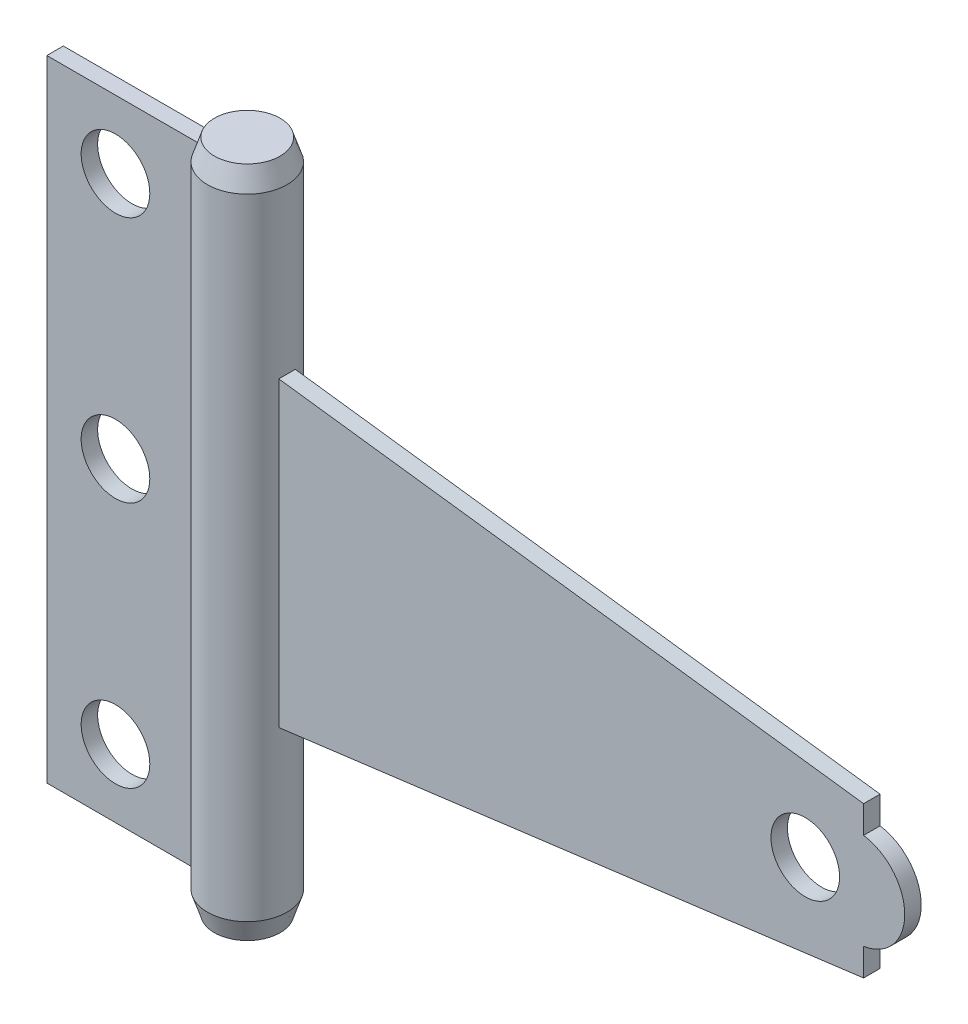
ISO-10303-21;
HEADER;
FILE_DESCRIPTION(('STEP AP214'),'2;1');
FILE_NAME('part.step','',(''),(''),'','','');
FILE_SCHEMA(('AUTOMOTIVE_DESIGN { 1 0 10303 214 1 1 1 1 }'));
ENDSEC;
DATA;
#1=APPLICATION_CONTEXT('core data for automotive mechanical design processes');
#2=APPLICATION_PROTOCOL_DEFINITION('international standard','automotive_design',2000,#1);
#3=PRODUCT_CONTEXT('',#1,'mechanical');
#4=PRODUCT('Part','Part','',(#3));
#5=PRODUCT_RELATED_PRODUCT_CATEGORY('part','',(#4));
#6=PRODUCT_DEFINITION_FORMATION('','',#4);
#7=PRODUCT_DEFINITION_CONTEXT('part definition',#1,'design');
#8=PRODUCT_DEFINITION('design','',#6,#7);
#9=PRODUCT_DEFINITION_SHAPE('','',#8);
#10=(LENGTH_UNIT() NAMED_UNIT(*) SI_UNIT(.MILLI.,.METRE.));
#11=(NAMED_UNIT(*) PLANE_ANGLE_UNIT() SI_UNIT($,.RADIAN.));
#12=(NAMED_UNIT(*) SI_UNIT($,.STERADIAN.) SOLID_ANGLE_UNIT());
#13=UNCERTAINTY_MEASURE_WITH_UNIT(LENGTH_MEASURE(1.E-05),#10,'distance_accuracy_value','');
#14=(GEOMETRIC_REPRESENTATION_CONTEXT(3) GLOBAL_UNCERTAINTY_ASSIGNED_CONTEXT((#13)) GLOBAL_UNIT_ASSIGNED_CONTEXT((#10,
#11,#12)) REPRESENTATION_CONTEXT('',''));
#15=CARTESIAN_POINT('',(0.,0.,0.));
#16=DIRECTION('',(0.,0.,1.));
#17=DIRECTION('',(1.,0.,0.));
#18=AXIS2_PLACEMENT_3D('',#15,#16,#17);
#19=CARTESIAN_POINT('',(0.,24.5,0.));
#20=DIRECTION('',(0.,1.,0.));
#21=DIRECTION('',(0.,0.,1.));
#22=AXIS2_PLACEMENT_3D('',#19,#20,#21);
#23=PLANE('',#22);
#24=CARTESIAN_POINT('',(0.,24.5,0.));
#25=DIRECTION('',(0.,-1.,0.));
#26=DIRECTION('',(0.,0.,-1.));
#27=AXIS2_PLACEMENT_3D('',#24,#25,#26);
#28=CIRCLE('',#27,2.39399158911085);
#29=CARTESIAN_POINT('',(0.,24.5,-2.39399158911085));
#30=VERTEX_POINT('',#29);
#31=EDGE_CURVE('E64',#30,#30,#28,.T.);
#32=ORIENTED_EDGE('',*,*,#31,.F.);
#33=EDGE_LOOP('',(#32));
#34=FACE_BOUND('',#33,.T.);
#35=ADVANCED_FACE('F50',(#34),#23,.T.);
#36=CARTESIAN_POINT('',(0.,-24.5,0.));
#37=DIRECTION('',(0.,1.,0.));
#38=DIRECTION('',(0.,0.,1.));
#39=AXIS2_PLACEMENT_3D('',#36,#37,#38);
#40=PLANE('',#39);
#41=CARTESIAN_POINT('',(0.,-24.5,0.));
#42=DIRECTION('',(0.,-1.,0.));
#43=DIRECTION('',(0.,0.,-1.));
#44=AXIS2_PLACEMENT_3D('',#41,#42,#43);
#45=CIRCLE('',#44,2.39399158911085);
#46=CARTESIAN_POINT('',(0.,-24.5,-2.39399158911085));
#47=VERTEX_POINT('',#46);
#48=EDGE_CURVE('E11',#47,#47,#45,.T.);
#49=ORIENTED_EDGE('',*,*,#48,.T.);
#50=EDGE_LOOP('',(#49));
#51=FACE_BOUND('',#50,.T.);
#52=ADVANCED_FACE('F73',(#51),#40,.F.);
#53=CARTESIAN_POINT('',(0.,-24.5,0.));
#54=DIRECTION('',(0.,1.,0.));
#55=DIRECTION('',(0.,0.,1.));
#56=AXIS2_PLACEMENT_3D('',#53,#54,#55);
#57=CONICAL_SURFACE('',#56,2.39399158911085,0.315549176334795);
#58=CARTESIAN_POINT('',(0.,-22.95,0.));
#59=DIRECTION('',(0.,-1.,0.));
#60=DIRECTION('',(0.,0.,-1.));
#61=AXIS2_PLACEMENT_3D('',#58,#59,#60);
#62=CIRCLE('',#61,2.9);
#63=CARTESIAN_POINT('',(0.,-22.95,-2.9));
#64=VERTEX_POINT('',#63);
#65=EDGE_CURVE('E56',#64,#64,#62,.T.);
#66=ORIENTED_EDGE('',*,*,#65,.T.);
#67=EDGE_LOOP('',(#66));
#68=FACE_BOUND('',#67,.T.);
#69=ORIENTED_EDGE('',*,*,#48,.F.);
#70=EDGE_LOOP('',(#69));
#71=FACE_BOUND('',#70,.T.);
#72=ADVANCED_FACE('F77',(#68,#71),#57,.T.);
#73=CARTESIAN_POINT('',(0.,0.,0.));
#74=DIRECTION('',(0.,-1.,0.));
#75=DIRECTION('',(0.,0.,-1.));
#76=AXIS2_PLACEMENT_3D('',#73,#74,#75);
#77=CYLINDRICAL_SURFACE('',#76,2.9);
#78=CARTESIAN_POINT('',(0.,22.95,0.));
#79=DIRECTION('',(0.,-1.,0.));
#80=DIRECTION('',(0.,0.,-1.));
#81=AXIS2_PLACEMENT_3D('',#78,#79,#80);
#82=CIRCLE('',#81,2.9);
#83=CARTESIAN_POINT('',(0.,22.95,-2.9));
#84=VERTEX_POINT('',#83);
#85=EDGE_CURVE('E60',#84,#84,#82,.T.);
#86=ORIENTED_EDGE('',*,*,#85,.T.);
#87=EDGE_LOOP('',(#86));
#88=FACE_BOUND('',#87,.T.);
#89=ORIENTED_EDGE('',*,*,#65,.F.);
#90=EDGE_LOOP('',(#89));
#91=FACE_BOUND('',#90,.T.);
#92=ADVANCED_FACE('F81',(#88,#91),#77,.T.);
#93=CARTESIAN_POINT('',(0.,24.5,0.));
#94=DIRECTION('',(0.,-1.,0.));
#95=DIRECTION('',(0.,0.,-1.));
#96=AXIS2_PLACEMENT_3D('',#93,#94,#95);
#97=CONICAL_SURFACE('',#96,2.39399158911085,0.315549176334797);
#98=ORIENTED_EDGE('',*,*,#85,.F.);
#99=EDGE_LOOP('',(#98));
#100=FACE_BOUND('',#99,.T.);
#101=ORIENTED_EDGE('',*,*,#31,.T.);
#102=EDGE_LOOP('',(#101));
#103=FACE_BOUND('',#102,.T.);
#104=ADVANCED_FACE('F70',(#100,#103),#97,.T.);
#105=CLOSED_SHELL('',(#35,#52,#72,#92,#104));
#106=MANIFOLD_SOLID_BREP('B2',#105);
#107=CARTESIAN_POINT('',(44.9583333333333,0.,0.6));
#108=DIRECTION('',(0.,0.,-1.));
#109=DIRECTION('',(-1.,0.,0.));
#110=AXIS2_PLACEMENT_3D('',#107,#108,#109);
#111=CYLINDRICAL_SURFACE('',#110,3.54166666666667);
#112=CARTESIAN_POINT('',(44.9583333333333,0.,-0.6));
#113=DIRECTION('',(0.,0.,1.));
#114=DIRECTION('',(1.,0.,0.));
#115=AXIS2_PLACEMENT_3D('',#112,#113,#114);
#116=CIRCLE('',#115,3.54166666666667);
#117=CARTESIAN_POINT('',(45.5,3.5,-0.6));
#118=VERTEX_POINT('',#117);
#119=CARTESIAN_POINT('',(45.5,-3.5,-0.6));
#120=VERTEX_POINT('',#119);
#121=EDGE_CURVE('E231',#118,#120,#116,.F.);
#122=ORIENTED_EDGE('',*,*,#121,.F.);
#123=DIRECTION('',(0.,0.,-1.));
#124=VECTOR('',#123,1.);
#125=CARTESIAN_POINT('',(45.5,3.5,0.6));
#126=LINE('',#125,#124);
#127=CARTESIAN_POINT('',(45.5,3.5,0.6));
#128=VERTEX_POINT('',#127);
#129=EDGE_CURVE('E48',#128,#118,#126,.T.);
#130=ORIENTED_EDGE('',*,*,#129,.F.);
#131=CARTESIAN_POINT('',(44.9583333333333,0.,0.6));
#132=DIRECTION('',(0.,0.,1.));
#133=DIRECTION('',(1.,0.,0.));
#134=AXIS2_PLACEMENT_3D('',#131,#132,#133);
#135=CIRCLE('',#134,3.54166666666667);
#136=CARTESIAN_POINT('',(45.5,-3.5,0.6));
#137=VERTEX_POINT('',#136);
#138=EDGE_CURVE('E271',#128,#137,#135,.F.);
#139=ORIENTED_EDGE('',*,*,#138,.T.);
#140=DIRECTION('',(0.,0.,-1.));
#141=VECTOR('',#140,1.);
#142=CARTESIAN_POINT('',(45.5,-3.5,0.6));
#143=LINE('',#142,#141);
#144=EDGE_CURVE('E181',#137,#120,#143,.T.);
#145=ORIENTED_EDGE('',*,*,#144,.T.);
#146=EDGE_LOOP('',(#122,#130,#139,#145));
#147=FACE_BOUND('',#146,.T.);
#148=ADVANCED_FACE('F136',(#147),#111,.T.);
#149=CARTESIAN_POINT('',(45.5,0.,0.6));
#150=DIRECTION('',(1.,0.,0.));
#151=DIRECTION('',(0.,0.,-1.));
#152=AXIS2_PLACEMENT_3D('',#149,#150,#151);
#153=PLANE('',#152);
#154=DIRECTION('',(0.,-1.,0.));
#155=VECTOR('',#154,1.);
#156=CARTESIAN_POINT('',(45.5,0.,-0.6));
#157=LINE('',#156,#155);
#158=CARTESIAN_POINT('',(45.5,5.5,-0.6));
#159=VERTEX_POINT('',#158);
#160=EDGE_CURVE('E229',#159,#118,#157,.T.);
#161=ORIENTED_EDGE('',*,*,#160,.F.);
#162=DIRECTION('',(0.,0.,-1.));
#163=VECTOR('',#162,1.);
#164=CARTESIAN_POINT('',(45.5,5.5,0.6));
#165=LINE('',#164,#163);
#166=CARTESIAN_POINT('',(45.5,5.5,0.6));
#167=VERTEX_POINT('',#166);
#168=EDGE_CURVE('E145',#167,#159,#165,.T.);
#169=ORIENTED_EDGE('',*,*,#168,.F.);
#170=DIRECTION('',(0.,-1.,0.));
#171=VECTOR('',#170,1.);
#172=CARTESIAN_POINT('',(45.5,0.,0.6));
#173=LINE('',#172,#171);
#174=EDGE_CURVE('E273',#167,#128,#173,.T.);
#175=ORIENTED_EDGE('',*,*,#174,.T.);
#176=ORIENTED_EDGE('',*,*,#129,.T.);
#177=EDGE_LOOP('',(#161,#169,#175,#176));
#178=FACE_BOUND('',#177,.T.);
#179=ADVANCED_FACE('F230',(#178),#153,.T.);
#180=CARTESIAN_POINT('',(1.44445016558176,11.1879231006878,0.6));
#181=DIRECTION('',(0.128045207218911,0.991768332277385,0.));
#182=DIRECTION('',(-0.991768332277385,0.128045207218911,0.));
#183=AXIS2_PLACEMENT_3D('',#180,#181,#182);
#184=PLANE('',#183);
#185=DIRECTION('',(0.991768332277385,-0.128045207218911,0.));
#186=VECTOR('',#185,1.);
#187=CARTESIAN_POINT('',(1.44445016558176,11.1879231006878,-0.6));
#188=LINE('',#187,#186);
#189=CARTESIAN_POINT('',(2.9,11.,-0.6));
#190=VERTEX_POINT('',#189);
#191=EDGE_CURVE('E225',#190,#159,#188,.T.);
#192=ORIENTED_EDGE('',*,*,#191,.F.);
#193=DIRECTION('',(0.,0.,-1.));
#194=VECTOR('',#193,1.);
#195=CARTESIAN_POINT('',(2.9,11.,0.6));
#196=LINE('',#195,#194);
#197=CARTESIAN_POINT('',(2.9,11.,0.6));
#198=VERTEX_POINT('',#197);
#199=EDGE_CURVE('E215',#198,#190,#196,.T.);
#200=ORIENTED_EDGE('',*,*,#199,.F.);
#201=DIRECTION('',(0.991768332277385,-0.128045207218911,0.));
#202=VECTOR('',#201,1.);
#203=CARTESIAN_POINT('',(1.44445016558176,11.1879231006878,0.6));
#204=LINE('',#203,#202);
#205=EDGE_CURVE('E209',#198,#167,#204,.T.);
#206=ORIENTED_EDGE('',*,*,#205,.T.);
#207=ORIENTED_EDGE('',*,*,#168,.T.);
#208=EDGE_LOOP('',(#192,#200,#206,#207));
#209=FACE_BOUND('',#208,.T.);
#210=ADVANCED_FACE('F223',(#209),#184,.T.);
#211=CARTESIAN_POINT('',(2.9,0.,0.6));
#212=DIRECTION('',(1.,0.,0.));
#213=DIRECTION('',(0.,0.,-1.));
#214=AXIS2_PLACEMENT_3D('',#211,#212,#213);
#215=PLANE('',#214);
#216=DIRECTION('',(0.,-1.,0.));
#217=VECTOR('',#216,1.);
#218=CARTESIAN_POINT('',(2.9,0.,-0.6));
#219=LINE('',#218,#217);
#220=CARTESIAN_POINT('',(2.9,-11.,-0.6));
#221=VERTEX_POINT('',#220);
#222=EDGE_CURVE('E214',#190,#221,#219,.T.);
#223=ORIENTED_EDGE('',*,*,#222,.T.);
#224=DIRECTION('',(0.,0.,-1.));
#225=VECTOR('',#224,1.);
#226=CARTESIAN_POINT('',(2.9,-11.,0.6));
#227=LINE('',#226,#225);
#228=CARTESIAN_POINT('',(2.9,-11.,0.6));
#229=VERTEX_POINT('',#228);
#230=EDGE_CURVE('E199',#229,#221,#227,.T.);
#231=ORIENTED_EDGE('',*,*,#230,.F.);
#232=DIRECTION('',(0.,-1.,0.));
#233=VECTOR('',#232,1.);
#234=CARTESIAN_POINT('',(2.9,0.,0.6));
#235=LINE('',#234,#233);
#236=EDGE_CURVE('E202',#198,#229,#235,.T.);
#237=ORIENTED_EDGE('',*,*,#236,.F.);
#238=ORIENTED_EDGE('',*,*,#199,.T.);
#239=EDGE_LOOP('',(#223,#231,#237,#238));
#240=FACE_BOUND('',#239,.T.);
#241=ADVANCED_FACE('F212',(#240),#215,.F.);
#242=CARTESIAN_POINT('',(1.44445016558176,-11.1879231006878,0.6));
#243=DIRECTION('',(-0.128045207218911,0.991768332277385,0.));
#244=DIRECTION('',(-0.991768332277385,-0.128045207218911,0.));
#245=AXIS2_PLACEMENT_3D('',#242,#243,#244);
#246=PLANE('',#245);
#247=DIRECTION('',(0.991768332277385,0.128045207218911,0.));
#248=VECTOR('',#247,1.);
#249=CARTESIAN_POINT('',(1.44445016558176,-11.1879231006878,-0.6));
#250=LINE('',#249,#248);
#251=CARTESIAN_POINT('',(45.5,-5.5,-0.6));
#252=VERTEX_POINT('',#251);
#253=EDGE_CURVE('E235',#221,#252,#250,.T.);
#254=ORIENTED_EDGE('',*,*,#253,.T.);
#255=DIRECTION('',(0.,0.,-1.));
#256=VECTOR('',#255,1.);
#257=CARTESIAN_POINT('',(45.5,-5.5,0.6));
#258=LINE('',#257,#256);
#259=CARTESIAN_POINT('',(45.5,-5.5,0.6));
#260=VERTEX_POINT('',#259);
#261=EDGE_CURVE('E201',#260,#252,#258,.T.);
#262=ORIENTED_EDGE('',*,*,#261,.F.);
#263=DIRECTION('',(0.991768332277385,0.128045207218911,0.));
#264=VECTOR('',#263,1.);
#265=CARTESIAN_POINT('',(1.44445016558176,-11.1879231006878,0.6));
#266=LINE('',#265,#264);
#267=EDGE_CURVE('E194',#229,#260,#266,.T.);
#268=ORIENTED_EDGE('',*,*,#267,.F.);
#269=ORIENTED_EDGE('',*,*,#230,.T.);
#270=EDGE_LOOP('',(#254,#262,#268,#269));
#271=FACE_BOUND('',#270,.T.);
#272=ADVANCED_FACE('F197',(#271),#246,.F.);
#273=CARTESIAN_POINT('',(41.25,0.,0.6));
#274=DIRECTION('',(0.,0.,-1.));
#275=DIRECTION('',(-1.,0.,0.));
#276=AXIS2_PLACEMENT_3D('',#273,#274,#275);
#277=CYLINDRICAL_SURFACE('',#276,2.5);
#278=CARTESIAN_POINT('',(41.25,0.,0.6));
#279=DIRECTION('',(0.,0.,1.));
#280=DIRECTION('',(1.,0.,0.));
#281=AXIS2_PLACEMENT_3D('',#278,#279,#280);
#282=CIRCLE('',#281,2.5);
#283=CARTESIAN_POINT('',(43.75,0.,0.6));
#284=VERTEX_POINT('',#283);
#285=EDGE_CURVE('E240',#284,#284,#282,.T.);
#286=ORIENTED_EDGE('',*,*,#285,.T.);
#287=EDGE_LOOP('',(#286));
#288=FACE_BOUND('',#287,.T.);
#289=CARTESIAN_POINT('',(41.25,0.,-0.6));
#290=DIRECTION('',(0.,0.,1.));
#291=DIRECTION('',(1.,0.,0.));
#292=AXIS2_PLACEMENT_3D('',#289,#290,#291);
#293=CIRCLE('',#292,2.5);
#294=CARTESIAN_POINT('',(43.75,0.,-0.6));
#295=VERTEX_POINT('',#294);
#296=EDGE_CURVE('E243',#295,#295,#293,.T.);
#297=ORIENTED_EDGE('',*,*,#296,.F.);
#298=EDGE_LOOP('',(#297));
#299=FACE_BOUND('',#298,.T.);
#300=ADVANCED_FACE('F138',(#288,#299),#277,.F.);
#301=CARTESIAN_POINT('',(45.5,0.,0.6));
#302=DIRECTION('',(-1.,0.,0.));
#303=DIRECTION('',(0.,0.,1.));
#304=AXIS2_PLACEMENT_3D('',#301,#302,#303);
#305=PLANE('',#304);
#306=DIRECTION('',(0.,1.,0.));
#307=VECTOR('',#306,1.);
#308=CARTESIAN_POINT('',(45.5,0.,-0.6));
#309=LINE('',#308,#307);
#310=EDGE_CURVE('E174',#252,#120,#309,.T.);
#311=ORIENTED_EDGE('',*,*,#310,.T.);
#312=ORIENTED_EDGE('',*,*,#144,.F.);
#313=DIRECTION('',(0.,1.,0.));
#314=VECTOR('',#313,1.);
#315=CARTESIAN_POINT('',(45.5,0.,0.6));
#316=LINE('',#315,#314);
#317=EDGE_CURVE('E153',#260,#137,#316,.T.);
#318=ORIENTED_EDGE('',*,*,#317,.F.);
#319=ORIENTED_EDGE('',*,*,#261,.T.);
#320=EDGE_LOOP('',(#311,#312,#318,#319));
#321=FACE_BOUND('',#320,.T.);
#322=ADVANCED_FACE('F257',(#321),#305,.F.);
#323=CARTESIAN_POINT('',(0.,0.,0.6));
#324=DIRECTION('',(0.,0.,1.));
#325=DIRECTION('',(1.,0.,0.));
#326=AXIS2_PLACEMENT_3D('',#323,#324,#325);
#327=PLANE('',#326);
#328=ORIENTED_EDGE('',*,*,#285,.F.);
#329=EDGE_LOOP('',(#328));
#330=FACE_BOUND('',#329,.T.);
#331=ORIENTED_EDGE('',*,*,#138,.F.);
#332=ORIENTED_EDGE('',*,*,#174,.F.);
#333=ORIENTED_EDGE('',*,*,#205,.F.);
#334=ORIENTED_EDGE('',*,*,#236,.T.);
#335=ORIENTED_EDGE('',*,*,#267,.T.);
#336=ORIENTED_EDGE('',*,*,#317,.T.);
#337=EDGE_LOOP('',(#331,#332,#333,#334,#335,#336));
#338=FACE_BOUND('',#337,.T.);
#339=ADVANCED_FACE('F206',(#330,#338),#327,.T.);
#340=CARTESIAN_POINT('',(0.,0.,-0.6));
#341=DIRECTION('',(0.,0.,1.));
#342=DIRECTION('',(1.,0.,0.));
#343=AXIS2_PLACEMENT_3D('',#340,#341,#342);
#344=PLANE('',#343);
#345=ORIENTED_EDGE('',*,*,#296,.T.);
#346=EDGE_LOOP('',(#345));
#347=FACE_BOUND('',#346,.T.);
#348=ORIENTED_EDGE('',*,*,#121,.T.);
#349=ORIENTED_EDGE('',*,*,#310,.F.);
#350=ORIENTED_EDGE('',*,*,#253,.F.);
#351=ORIENTED_EDGE('',*,*,#222,.F.);
#352=ORIENTED_EDGE('',*,*,#191,.T.);
#353=ORIENTED_EDGE('',*,*,#160,.T.);
#354=EDGE_LOOP('',(#348,#349,#350,#351,#352,#353));
#355=FACE_BOUND('',#354,.T.);
#356=ADVANCED_FACE('F233',(#347,#355),#344,.F.);
#357=CLOSED_SHELL('',(#148,#179,#210,#241,#272,#300,#322,#339,#356));
#358=MANIFOLD_SOLID_BREP('B6',#357);
#359=CARTESIAN_POINT('',(0.,-22.95,0.6));
#360=DIRECTION('',(0.,-1.,0.));
#361=DIRECTION('',(1.,0.,0.));
#362=AXIS2_PLACEMENT_3D('',#359,#360,#361);
#363=PLANE('',#362);
#364=DIRECTION('',(-1.,0.,0.));
#365=VECTOR('',#364,1.);
#366=CARTESIAN_POINT('',(0.,-22.95,-0.6));
#367=LINE('',#366,#365);
#368=CARTESIAN_POINT('',(-2.9,-22.95,-0.6));
#369=VERTEX_POINT('',#368);
#370=CARTESIAN_POINT('',(-14.,-22.95,-0.6));
#371=VERTEX_POINT('',#370);
#372=EDGE_CURVE('E410',#369,#371,#367,.T.);
#373=ORIENTED_EDGE('',*,*,#372,.F.);
#374=DIRECTION('',(0.,0.,-1.));
#375=VECTOR('',#374,1.);
#376=CARTESIAN_POINT('',(-2.9,-22.95,0.6));
#377=LINE('',#376,#375);
#378=CARTESIAN_POINT('',(-2.9,-22.95,0.6));
#379=VERTEX_POINT('',#378);
#380=EDGE_CURVE('E134',#379,#369,#377,.T.);
#381=ORIENTED_EDGE('',*,*,#380,.F.);
#382=DIRECTION('',(-1.,0.,0.));
#383=VECTOR('',#382,1.);
#384=CARTESIAN_POINT('',(0.,-22.95,0.6));
#385=LINE('',#384,#383);
#386=CARTESIAN_POINT('',(-14.,-22.95,0.6));
#387=VERTEX_POINT('',#386);
#388=EDGE_CURVE('E394',#379,#387,#385,.T.);
#389=ORIENTED_EDGE('',*,*,#388,.T.);
#390=DIRECTION('',(0.,0.,-1.));
#391=VECTOR('',#390,1.);
#392=CARTESIAN_POINT('',(-14.,-22.95,0.6));
#393=LINE('',#392,#391);
#394=EDGE_CURVE('E373',#387,#371,#393,.T.);
#395=ORIENTED_EDGE('',*,*,#394,.T.);
#396=EDGE_LOOP('',(#373,#381,#389,#395));
#397=FACE_BOUND('',#396,.T.);
#398=ADVANCED_FACE('F333',(#397),#363,.T.);
#399=CARTESIAN_POINT('',(-2.9,0.,0.6));
#400=DIRECTION('',(1.,0.,0.));
#401=DIRECTION('',(0.,0.,-1.));
#402=AXIS2_PLACEMENT_3D('',#399,#400,#401);
#403=PLANE('',#402);
#404=DIRECTION('',(0.,-1.,0.));
#405=VECTOR('',#404,1.);
#406=CARTESIAN_POINT('',(-2.9,0.,-0.6));
#407=LINE('',#406,#405);
#408=CARTESIAN_POINT('',(-2.9,22.95,-0.6));
#409=VERTEX_POINT('',#408);
#410=EDGE_CURVE('E385',#409,#369,#407,.T.);
#411=ORIENTED_EDGE('',*,*,#410,.F.);
#412=DIRECTION('',(0.,0.,-1.));
#413=VECTOR('',#412,1.);
#414=CARTESIAN_POINT('',(-2.9,22.95,0.6));
#415=LINE('',#414,#413);
#416=CARTESIAN_POINT('',(-2.9,22.95,0.6));
#417=VERTEX_POINT('',#416);
#418=EDGE_CURVE('E342',#417,#409,#415,.T.);
#419=ORIENTED_EDGE('',*,*,#418,.F.);
#420=DIRECTION('',(0.,-1.,0.));
#421=VECTOR('',#420,1.);
#422=CARTESIAN_POINT('',(-2.9,0.,0.6));
#423=LINE('',#422,#421);
#424=EDGE_CURVE('E383',#417,#379,#423,.T.);
#425=ORIENTED_EDGE('',*,*,#424,.T.);
#426=ORIENTED_EDGE('',*,*,#380,.T.);
#427=EDGE_LOOP('',(#411,#419,#425,#426));
#428=FACE_BOUND('',#427,.T.);
#429=ADVANCED_FACE('F381',(#428),#403,.T.);
#430=CARTESIAN_POINT('',(0.,22.95,0.6));
#431=DIRECTION('',(0.,-1.,0.));
#432=DIRECTION('',(1.,0.,0.));
#433=AXIS2_PLACEMENT_3D('',#430,#431,#432);
#434=PLANE('',#433);
#435=DIRECTION('',(-1.,0.,0.));
#436=VECTOR('',#435,1.);
#437=CARTESIAN_POINT('',(0.,22.95,-0.6));
#438=LINE('',#437,#436);
#439=CARTESIAN_POINT('',(-14.,22.95,-0.6));
#440=VERTEX_POINT('',#439);
#441=EDGE_CURVE('E413',#409,#440,#438,.T.);
#442=ORIENTED_EDGE('',*,*,#441,.T.);
#443=DIRECTION('',(0.,0.,-1.));
#444=VECTOR('',#443,1.);
#445=CARTESIAN_POINT('',(-14.,22.95,0.6));
#446=LINE('',#445,#444);
#447=CARTESIAN_POINT('',(-14.,22.95,0.6));
#448=VERTEX_POINT('',#447);
#449=EDGE_CURVE('E388',#448,#440,#446,.T.);
#450=ORIENTED_EDGE('',*,*,#449,.F.);
#451=DIRECTION('',(-1.,0.,0.));
#452=VECTOR('',#451,1.);
#453=CARTESIAN_POINT('',(0.,22.95,0.6));
#454=LINE('',#453,#452);
#455=EDGE_CURVE('E390',#417,#448,#454,.T.);
#456=ORIENTED_EDGE('',*,*,#455,.F.);
#457=ORIENTED_EDGE('',*,*,#418,.T.);
#458=EDGE_LOOP('',(#442,#450,#456,#457));
#459=FACE_BOUND('',#458,.T.);
#460=ADVANCED_FACE('F391',(#459),#434,.F.);
#461=CARTESIAN_POINT('',(-9.,18.,0.6));
#462=DIRECTION('',(0.,0.,-1.));
#463=DIRECTION('',(-1.,0.,0.));
#464=AXIS2_PLACEMENT_3D('',#461,#462,#463);
#465=CYLINDRICAL_SURFACE('',#464,2.5);
#466=CARTESIAN_POINT('',(-9.,18.,0.6));
#467=DIRECTION('',(0.,0.,1.));
#468=DIRECTION('',(1.,0.,0.));
#469=AXIS2_PLACEMENT_3D('',#466,#467,#468);
#470=CIRCLE('',#469,2.5);
#471=CARTESIAN_POINT('',(-6.5,18.,0.6));
#472=VERTEX_POINT('',#471);
#473=EDGE_CURVE('E396',#472,#472,#470,.T.);
#474=ORIENTED_EDGE('',*,*,#473,.T.);
#475=EDGE_LOOP('',(#474));
#476=FACE_BOUND('',#475,.T.);
#477=CARTESIAN_POINT('',(-9.,18.,-0.6));
#478=DIRECTION('',(0.,0.,1.));
#479=DIRECTION('',(1.,0.,0.));
#480=AXIS2_PLACEMENT_3D('',#477,#478,#479);
#481=CIRCLE('',#480,2.5);
#482=CARTESIAN_POINT('',(-6.5,18.,-0.6));
#483=VERTEX_POINT('',#482);
#484=EDGE_CURVE('E407',#483,#483,#481,.T.);
#485=ORIENTED_EDGE('',*,*,#484,.F.);
#486=EDGE_LOOP('',(#485));
#487=FACE_BOUND('',#486,.T.);
#488=ADVANCED_FACE('F429',(#476,#487),#465,.F.);
#489=CARTESIAN_POINT('',(-9.,0.,0.6));
#490=DIRECTION('',(0.,0.,-1.));
#491=DIRECTION('',(-1.,0.,0.));
#492=AXIS2_PLACEMENT_3D('',#489,#490,#491);
#493=CYLINDRICAL_SURFACE('',#492,2.5);
#494=CARTESIAN_POINT('',(-9.,0.,0.6));
#495=DIRECTION('',(0.,0.,1.));
#496=DIRECTION('',(1.,0.,0.));
#497=AXIS2_PLACEMENT_3D('',#494,#495,#496);
#498=CIRCLE('',#497,2.5);
#499=CARTESIAN_POINT('',(-6.5,0.,0.6));
#500=VERTEX_POINT('',#499);
#501=EDGE_CURVE('E442',#500,#500,#498,.T.);
#502=ORIENTED_EDGE('',*,*,#501,.T.);
#503=EDGE_LOOP('',(#502));
#504=FACE_BOUND('',#503,.T.);
#505=CARTESIAN_POINT('',(-9.,0.,-0.6));
#506=DIRECTION('',(0.,0.,1.));
#507=DIRECTION('',(1.,0.,0.));
#508=AXIS2_PLACEMENT_3D('',#505,#506,#507);
#509=CIRCLE('',#508,2.5);
#510=CARTESIAN_POINT('',(-6.5,0.,-0.6));
#511=VERTEX_POINT('',#510);
#512=EDGE_CURVE('E404',#511,#511,#509,.T.);
#513=ORIENTED_EDGE('',*,*,#512,.F.);
#514=EDGE_LOOP('',(#513));
#515=FACE_BOUND('',#514,.T.);
#516=ADVANCED_FACE('F431',(#504,#515),#493,.F.);
#517=CARTESIAN_POINT('',(-9.,-18.,0.6));
#518=DIRECTION('',(0.,0.,-1.));
#519=DIRECTION('',(-1.,0.,0.));
#520=AXIS2_PLACEMENT_3D('',#517,#518,#519);
#521=CYLINDRICAL_SURFACE('',#520,2.5);
#522=CARTESIAN_POINT('',(-9.,-18.,0.6));
#523=DIRECTION('',(0.,0.,1.));
#524=DIRECTION('',(1.,0.,0.));
#525=AXIS2_PLACEMENT_3D('',#522,#523,#524);
#526=CIRCLE('',#525,2.5);
#527=CARTESIAN_POINT('',(-6.5,-18.,0.6));
#528=VERTEX_POINT('',#527);
#529=EDGE_CURVE('E416',#528,#528,#526,.T.);
#530=ORIENTED_EDGE('',*,*,#529,.T.);
#531=EDGE_LOOP('',(#530));
#532=FACE_BOUND('',#531,.T.);
#533=CARTESIAN_POINT('',(-9.,-18.,-0.6));
#534=DIRECTION('',(0.,0.,1.));
#535=DIRECTION('',(1.,0.,0.));
#536=AXIS2_PLACEMENT_3D('',#533,#534,#535);
#537=CIRCLE('',#536,2.5);
#538=CARTESIAN_POINT('',(-6.5,-18.,-0.6));
#539=VERTEX_POINT('',#538);
#540=EDGE_CURVE('E401',#539,#539,#537,.T.);
#541=ORIENTED_EDGE('',*,*,#540,.F.);
#542=EDGE_LOOP('',(#541));
#543=FACE_BOUND('',#542,.T.);
#544=ADVANCED_FACE('F335',(#532,#543),#521,.F.);
#545=CARTESIAN_POINT('',(-14.,0.,0.6));
#546=DIRECTION('',(1.,0.,0.));
#547=DIRECTION('',(0.,0.,-1.));
#548=AXIS2_PLACEMENT_3D('',#545,#546,#547);
#549=PLANE('',#548);
#550=DIRECTION('',(0.,-1.,0.));
#551=VECTOR('',#550,1.);
#552=CARTESIAN_POINT('',(-14.,0.,-0.6));
#553=LINE('',#552,#551);
#554=EDGE_CURVE('E366',#440,#371,#553,.T.);
#555=ORIENTED_EDGE('',*,*,#554,.T.);
#556=ORIENTED_EDGE('',*,*,#394,.F.);
#557=DIRECTION('',(0.,-1.,0.));
#558=VECTOR('',#557,1.);
#559=CARTESIAN_POINT('',(-14.,0.,0.6));
#560=LINE('',#559,#558);
#561=EDGE_CURVE('E350',#448,#387,#560,.T.);
#562=ORIENTED_EDGE('',*,*,#561,.F.);
#563=ORIENTED_EDGE('',*,*,#449,.T.);
#564=EDGE_LOOP('',(#555,#556,#562,#563));
#565=FACE_BOUND('',#564,.T.);
#566=ADVANCED_FACE('F419',(#565),#549,.F.);
#567=CARTESIAN_POINT('',(0.,0.,0.6));
#568=DIRECTION('',(0.,0.,1.));
#569=DIRECTION('',(1.,0.,0.));
#570=AXIS2_PLACEMENT_3D('',#567,#568,#569);
#571=PLANE('',#570);
#572=ORIENTED_EDGE('',*,*,#529,.F.);
#573=EDGE_LOOP('',(#572));
#574=FACE_BOUND('',#573,.T.);
#575=ORIENTED_EDGE('',*,*,#501,.F.);
#576=EDGE_LOOP('',(#575));
#577=FACE_BOUND('',#576,.T.);
#578=ORIENTED_EDGE('',*,*,#473,.F.);
#579=EDGE_LOOP('',(#578));
#580=FACE_BOUND('',#579,.T.);
#581=ORIENTED_EDGE('',*,*,#388,.F.);
#582=ORIENTED_EDGE('',*,*,#424,.F.);
#583=ORIENTED_EDGE('',*,*,#455,.T.);
#584=ORIENTED_EDGE('',*,*,#561,.T.);
#585=EDGE_LOOP('',(#581,#582,#583,#584));
#586=FACE_BOUND('',#585,.T.);
#587=ADVANCED_FACE('F393',(#574,#577,#580,#586),#571,.T.);
#588=CARTESIAN_POINT('',(0.,0.,-0.6));
#589=DIRECTION('',(0.,0.,1.));
#590=DIRECTION('',(1.,0.,0.));
#591=AXIS2_PLACEMENT_3D('',#588,#589,#590);
#592=PLANE('',#591);
#593=ORIENTED_EDGE('',*,*,#540,.T.);
#594=EDGE_LOOP('',(#593));
#595=FACE_BOUND('',#594,.T.);
#596=ORIENTED_EDGE('',*,*,#512,.T.);
#597=EDGE_LOOP('',(#596));
#598=FACE_BOUND('',#597,.T.);
#599=ORIENTED_EDGE('',*,*,#484,.T.);
#600=EDGE_LOOP('',(#599));
#601=FACE_BOUND('',#600,.T.);
#602=ORIENTED_EDGE('',*,*,#372,.T.);
#603=ORIENTED_EDGE('',*,*,#554,.F.);
#604=ORIENTED_EDGE('',*,*,#441,.F.);
#605=ORIENTED_EDGE('',*,*,#410,.T.);
#606=EDGE_LOOP('',(#602,#603,#604,#605));
#607=FACE_BOUND('',#606,.T.);
#608=ADVANCED_FACE('F420',(#595,#598,#601,#607),#592,.F.);
#609=CLOSED_SHELL('',(#398,#429,#460,#488,#516,#544,#566,#587,#608));
#610=MANIFOLD_SOLID_BREP('B42',#609);
#611=ADVANCED_BREP_SHAPE_REPRESENTATION('',(#18,#106,#358,#610),#14);
#612=SHAPE_DEFINITION_REPRESENTATION(#9,#611);
ENDSEC;
END-ISO-10303-21;
